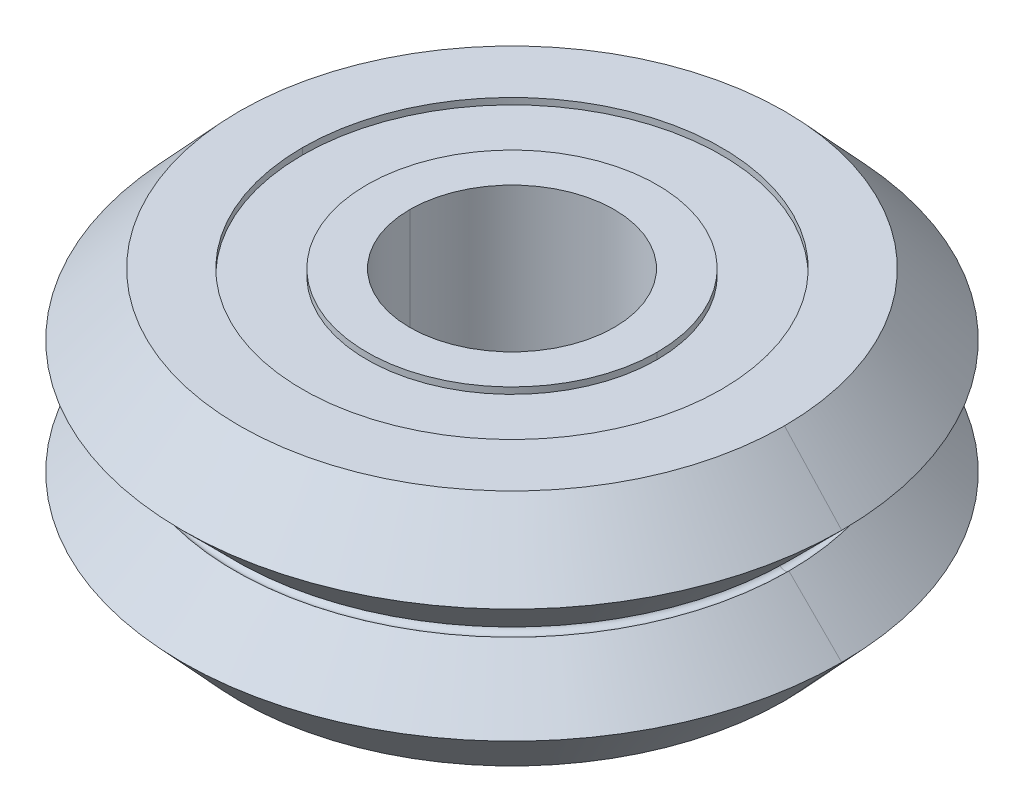
ISO-10303-21;
HEADER;
FILE_DESCRIPTION(('STEP AP214'),'2;1');
FILE_NAME('part.step','',(''),(''),'','','');
FILE_SCHEMA(('AUTOMOTIVE_DESIGN { 1 0 10303 214 1 1 1 1 }'));
ENDSEC;
DATA;
#1=APPLICATION_CONTEXT('core data for automotive mechanical design processes');
#2=APPLICATION_PROTOCOL_DEFINITION('international standard','automotive_design',2000,#1);
#3=PRODUCT_CONTEXT('',#1,'mechanical');
#4=PRODUCT('Part','Part','',(#3));
#5=PRODUCT_RELATED_PRODUCT_CATEGORY('part','',(#4));
#6=PRODUCT_DEFINITION_FORMATION('','',#4);
#7=PRODUCT_DEFINITION_CONTEXT('part definition',#1,'design');
#8=PRODUCT_DEFINITION('design','',#6,#7);
#9=PRODUCT_DEFINITION_SHAPE('','',#8);
#10=(LENGTH_UNIT() NAMED_UNIT(*) SI_UNIT(.MILLI.,.METRE.));
#11=(NAMED_UNIT(*) PLANE_ANGLE_UNIT() SI_UNIT($,.RADIAN.));
#12=(NAMED_UNIT(*) SI_UNIT($,.STERADIAN.) SOLID_ANGLE_UNIT());
#13=UNCERTAINTY_MEASURE_WITH_UNIT(LENGTH_MEASURE(1.E-05),#10,'distance_accuracy_value','');
#14=(GEOMETRIC_REPRESENTATION_CONTEXT(3) GLOBAL_UNCERTAINTY_ASSIGNED_CONTEXT((#13)) GLOBAL_UNIT_ASSIGNED_CONTEXT((#10,
#11,#12)) REPRESENTATION_CONTEXT('',''));
#15=CARTESIAN_POINT('',(0.,0.,0.));
#16=DIRECTION('',(0.,0.,1.));
#17=DIRECTION('',(1.,0.,0.));
#18=AXIS2_PLACEMENT_3D('',#15,#16,#17);
#19=CARTESIAN_POINT('',(0.,6.10500000000098,0.));
#20=DIRECTION('',(0.,-1.,0.));
#21=DIRECTION('',(-1.,0.,0.));
#22=AXIS2_PLACEMENT_3D('',#19,#20,#21);
#23=CYLINDRICAL_SURFACE('',#22,4.7625);
#24=CARTESIAN_POINT('',(0.,5.55000000000066,0.));
#25=DIRECTION('',(0.,1.,0.));
#26=DIRECTION('',(1.,0.,0.));
#27=AXIS2_PLACEMENT_3D('',#24,#25,#26);
#28=CIRCLE('',#27,4.7625);
#29=CARTESIAN_POINT('',(4.7625,5.55000000000066,0.));
#30=VERTEX_POINT('',#29);
#31=CARTESIAN_POINT('',(-4.7625,5.55000000000066,0.));
#32=VERTEX_POINT('',#31);
#33=EDGE_CURVE('E228',#30,#32,#28,.T.);
#34=ORIENTED_EDGE('',*,*,#33,.T.);
#35=DIRECTION('',(0.,-1.,0.));
#36=VECTOR('',#35,1.);
#37=CARTESIAN_POINT('',(-4.7625,5.55000000000066,0.));
#38=LINE('',#37,#36);
#39=CARTESIAN_POINT('',(-4.7625,-5.55000000000066,0.));
#40=VERTEX_POINT('',#39);
#41=EDGE_CURVE('E25',#32,#40,#38,.T.);
#42=ORIENTED_EDGE('',*,*,#41,.T.);
#43=CARTESIAN_POINT('',(0.,-5.55000000000066,0.));
#44=DIRECTION('',(0.,1.,0.));
#45=DIRECTION('',(1.,0.,0.));
#46=AXIS2_PLACEMENT_3D('',#43,#44,#45);
#47=CIRCLE('',#46,4.7625);
#48=CARTESIAN_POINT('',(4.7625,-5.55000000000066,0.));
#49=VERTEX_POINT('',#48);
#50=EDGE_CURVE('E601',#49,#40,#47,.T.);
#51=ORIENTED_EDGE('',*,*,#50,.F.);
#52=DIRECTION('',(0.,-1.,0.));
#53=VECTOR('',#52,1.);
#54=CARTESIAN_POINT('',(4.7625,5.55000000000066,0.));
#55=LINE('',#54,#53);
#56=EDGE_CURVE('E10',#30,#49,#55,.T.);
#57=ORIENTED_EDGE('',*,*,#56,.F.);
#58=EDGE_LOOP('',(#34,#42,#51,#57));
#59=FACE_BOUND('',#58,.T.);
#60=ADVANCED_FACE('F16',(#59),#23,.F.);
#61=CARTESIAN_POINT('',(0.,6.10500000000098,0.));
#62=DIRECTION('',(0.,-1.,0.));
#63=DIRECTION('',(-1.,0.,0.));
#64=AXIS2_PLACEMENT_3D('',#61,#62,#63);
#65=CYLINDRICAL_SURFACE('',#64,4.7625);
#66=CARTESIAN_POINT('',(0.,-5.55000000000066,0.));
#67=DIRECTION('',(0.,-1.,0.));
#68=DIRECTION('',(1.,0.,0.));
#69=AXIS2_PLACEMENT_3D('',#66,#67,#68);
#70=CIRCLE('',#69,4.7625);
#71=EDGE_CURVE('E585',#49,#40,#70,.T.);
#72=ORIENTED_EDGE('',*,*,#71,.T.);
#73=ORIENTED_EDGE('',*,*,#41,.F.);
#74=CARTESIAN_POINT('',(0.,5.55000000000066,0.));
#75=DIRECTION('',(0.,-1.,0.));
#76=DIRECTION('',(1.,0.,0.));
#77=AXIS2_PLACEMENT_3D('',#74,#75,#76);
#78=CIRCLE('',#77,4.7625);
#79=EDGE_CURVE('E19',#30,#32,#78,.T.);
#80=ORIENTED_EDGE('',*,*,#79,.F.);
#81=ORIENTED_EDGE('',*,*,#56,.T.);
#82=EDGE_LOOP('',(#72,#73,#80,#81));
#83=FACE_BOUND('',#82,.T.);
#84=ADVANCED_FACE('F290',(#83),#65,.F.);
#85=CARTESIAN_POINT('',(0.,5.55000000000066,0.));
#86=DIRECTION('',(0.,-1.,0.));
#87=DIRECTION('',(0.,0.,-1.));
#88=AXIS2_PLACEMENT_3D('',#85,#86,#87);
#89=PLANE('',#88);
#90=ORIENTED_EDGE('',*,*,#33,.F.);
#91=ORIENTED_EDGE('',*,*,#79,.T.);
#92=EDGE_LOOP('',(#90,#91));
#93=FACE_BOUND('',#92,.T.);
#94=CARTESIAN_POINT('',(0.,5.55000000000066,0.));
#95=DIRECTION('',(0.,-1.,0.));
#96=DIRECTION('',(1.,0.,0.));
#97=AXIS2_PLACEMENT_3D('',#94,#95,#96);
#98=CIRCLE('',#97,6.76249999999962);
#99=CARTESIAN_POINT('',(6.76249999999962,5.55000000000066,0.));
#100=VERTEX_POINT('',#99);
#101=CARTESIAN_POINT('',(-6.76249999999962,5.55000000000066,0.));
#102=VERTEX_POINT('',#101);
#103=EDGE_CURVE('E214',#100,#102,#98,.T.);
#104=ORIENTED_EDGE('',*,*,#103,.F.);
#105=CARTESIAN_POINT('',(0.,5.55000000000066,0.));
#106=DIRECTION('',(0.,1.,0.));
#107=DIRECTION('',(1.,0.,0.));
#108=AXIS2_PLACEMENT_3D('',#105,#106,#107);
#109=CIRCLE('',#108,6.76249999999962);
#110=EDGE_CURVE('E226',#100,#102,#109,.T.);
#111=ORIENTED_EDGE('',*,*,#110,.T.);
#112=EDGE_LOOP('',(#104,#111));
#113=FACE_BOUND('',#112,.T.);
#114=ADVANCED_FACE('F294',(#93,#113),#89,.F.);
#115=CARTESIAN_POINT('',(0.,6.10500000000098,0.));
#116=DIRECTION('',(0.,-1.,0.));
#117=DIRECTION('',(-1.,0.,0.));
#118=AXIS2_PLACEMENT_3D('',#115,#116,#117);
#119=CYLINDRICAL_SURFACE('',#118,6.76249999999962);
#120=CARTESIAN_POINT('',(0.,5.24999999999932,0.));
#121=DIRECTION('',(0.,1.,0.));
#122=DIRECTION('',(1.,0.,0.));
#123=AXIS2_PLACEMENT_3D('',#120,#121,#122);
#124=CIRCLE('',#123,6.76249999999962);
#125=CARTESIAN_POINT('',(6.76249999999962,5.24999999999932,0.));
#126=VERTEX_POINT('',#125);
#127=CARTESIAN_POINT('',(-6.76249999999962,5.24999999999932,0.));
#128=VERTEX_POINT('',#127);
#129=EDGE_CURVE('E206',#126,#128,#124,.T.);
#130=ORIENTED_EDGE('',*,*,#129,.T.);
#131=DIRECTION('',(0.,1.,0.));
#132=VECTOR('',#131,1.);
#133=CARTESIAN_POINT('',(-6.76249999999962,5.24999999999932,0.));
#134=LINE('',#133,#132);
#135=EDGE_CURVE('E218',#128,#102,#134,.T.);
#136=ORIENTED_EDGE('',*,*,#135,.T.);
#137=ORIENTED_EDGE('',*,*,#110,.F.);
#138=DIRECTION('',(0.,1.,0.));
#139=VECTOR('',#138,1.);
#140=CARTESIAN_POINT('',(6.76249999999962,5.24999999999932,0.));
#141=LINE('',#140,#139);
#142=EDGE_CURVE('E222',#126,#100,#141,.T.);
#143=ORIENTED_EDGE('',*,*,#142,.F.);
#144=EDGE_LOOP('',(#130,#136,#137,#143));
#145=FACE_BOUND('',#144,.T.);
#146=ADVANCED_FACE('F298',(#145),#119,.T.);
#147=CARTESIAN_POINT('',(0.,6.10500000000098,0.));
#148=DIRECTION('',(0.,-1.,0.));
#149=DIRECTION('',(-1.,0.,0.));
#150=AXIS2_PLACEMENT_3D('',#147,#148,#149);
#151=CYLINDRICAL_SURFACE('',#150,6.76249999999962);
#152=ORIENTED_EDGE('',*,*,#103,.T.);
#153=ORIENTED_EDGE('',*,*,#135,.F.);
#154=CARTESIAN_POINT('',(0.,5.24999999999932,0.));
#155=DIRECTION('',(0.,-1.,0.));
#156=DIRECTION('',(1.,0.,0.));
#157=AXIS2_PLACEMENT_3D('',#154,#155,#156);
#158=CIRCLE('',#157,6.76249999999962);
#159=EDGE_CURVE('E210',#126,#128,#158,.T.);
#160=ORIENTED_EDGE('',*,*,#159,.F.);
#161=ORIENTED_EDGE('',*,*,#142,.T.);
#162=EDGE_LOOP('',(#152,#153,#160,#161));
#163=FACE_BOUND('',#162,.T.);
#164=ADVANCED_FACE('F303',(#163),#151,.T.);
#165=CARTESIAN_POINT('',(0.,5.24999999999932,0.));
#166=DIRECTION('',(0.,-1.,0.));
#167=DIRECTION('',(0.,0.,-1.));
#168=AXIS2_PLACEMENT_3D('',#165,#166,#167);
#169=PLANE('',#168);
#170=ORIENTED_EDGE('',*,*,#129,.F.);
#171=ORIENTED_EDGE('',*,*,#159,.T.);
#172=EDGE_LOOP('',(#170,#171));
#173=FACE_BOUND('',#172,.T.);
#174=CARTESIAN_POINT('',(0.,5.24999999999932,0.));
#175=DIRECTION('',(0.,-1.,0.));
#176=DIRECTION('',(1.,0.,0.));
#177=AXIS2_PLACEMENT_3D('',#174,#175,#176);
#178=CIRCLE('',#177,9.76250000000032);
#179=CARTESIAN_POINT('',(9.76250000000032,5.24999999999932,0.));
#180=VERTEX_POINT('',#179);
#181=CARTESIAN_POINT('',(-9.76250000000032,5.24999999999932,0.));
#182=VERTEX_POINT('',#181);
#183=EDGE_CURVE('E185',#180,#182,#178,.T.);
#184=ORIENTED_EDGE('',*,*,#183,.F.);
#185=CARTESIAN_POINT('',(0.,5.24999999999932,0.));
#186=DIRECTION('',(0.,1.,0.));
#187=DIRECTION('',(1.,0.,0.));
#188=AXIS2_PLACEMENT_3D('',#185,#186,#187);
#189=CIRCLE('',#188,9.76250000000032);
#190=EDGE_CURVE('E173',#180,#182,#189,.T.);
#191=ORIENTED_EDGE('',*,*,#190,.T.);
#192=EDGE_LOOP('',(#184,#191));
#193=FACE_BOUND('',#192,.T.);
#194=ADVANCED_FACE('F307',(#173,#193),#169,.F.);
#195=CARTESIAN_POINT('',(0.,6.10500000000098,0.));
#196=DIRECTION('',(0.,-1.,0.));
#197=DIRECTION('',(-1.,0.,0.));
#198=AXIS2_PLACEMENT_3D('',#195,#196,#197);
#199=CYLINDRICAL_SURFACE('',#198,9.76250000000032);
#200=CARTESIAN_POINT('',(0.,5.55000000000066,0.));
#201=DIRECTION('',(0.,1.,0.));
#202=DIRECTION('',(1.,0.,0.));
#203=AXIS2_PLACEMENT_3D('',#200,#201,#202);
#204=CIRCLE('',#203,9.76250000000032);
#205=CARTESIAN_POINT('',(9.76250000000032,5.55000000000066,0.));
#206=VERTEX_POINT('',#205);
#207=CARTESIAN_POINT('',(-9.76250000000032,5.55000000000066,0.));
#208=VERTEX_POINT('',#207);
#209=EDGE_CURVE('E172',#206,#208,#204,.T.);
#210=ORIENTED_EDGE('',*,*,#209,.T.);
#211=DIRECTION('',(0.,-1.,0.));
#212=VECTOR('',#211,1.);
#213=CARTESIAN_POINT('',(-9.76250000000032,5.55000000000066,0.));
#214=LINE('',#213,#212);
#215=EDGE_CURVE('E178',#208,#182,#214,.T.);
#216=ORIENTED_EDGE('',*,*,#215,.T.);
#217=ORIENTED_EDGE('',*,*,#190,.F.);
#218=DIRECTION('',(0.,-1.,0.));
#219=VECTOR('',#218,1.);
#220=CARTESIAN_POINT('',(9.76250000000032,5.55000000000066,0.));
#221=LINE('',#220,#219);
#222=EDGE_CURVE('E167',#206,#180,#221,.T.);
#223=ORIENTED_EDGE('',*,*,#222,.F.);
#224=EDGE_LOOP('',(#210,#216,#217,#223));
#225=FACE_BOUND('',#224,.T.);
#226=ADVANCED_FACE('F169',(#225),#199,.F.);
#227=CARTESIAN_POINT('',(0.,6.10500000000098,0.));
#228=DIRECTION('',(0.,-1.,0.));
#229=DIRECTION('',(-1.,0.,0.));
#230=AXIS2_PLACEMENT_3D('',#227,#228,#229);
#231=CYLINDRICAL_SURFACE('',#230,9.76250000000032);
#232=ORIENTED_EDGE('',*,*,#183,.T.);
#233=ORIENTED_EDGE('',*,*,#215,.F.);
#234=CARTESIAN_POINT('',(0.,5.55000000000066,0.));
#235=DIRECTION('',(0.,-1.,0.));
#236=DIRECTION('',(1.,0.,0.));
#237=AXIS2_PLACEMENT_3D('',#234,#235,#236);
#238=CIRCLE('',#237,9.76250000000032);
#239=EDGE_CURVE('E181',#206,#208,#238,.T.);
#240=ORIENTED_EDGE('',*,*,#239,.F.);
#241=ORIENTED_EDGE('',*,*,#222,.T.);
#242=EDGE_LOOP('',(#232,#233,#240,#241));
#243=FACE_BOUND('',#242,.T.);
#244=ADVANCED_FACE('F182',(#243),#231,.F.);
#245=CARTESIAN_POINT('',(0.,5.55000000000066,0.));
#246=DIRECTION('',(0.,-1.,0.));
#247=DIRECTION('',(0.,0.,-1.));
#248=AXIS2_PLACEMENT_3D('',#245,#246,#247);
#249=PLANE('',#248);
#250=ORIENTED_EDGE('',*,*,#209,.F.);
#251=ORIENTED_EDGE('',*,*,#239,.T.);
#252=EDGE_LOOP('',(#250,#251));
#253=FACE_BOUND('',#252,.T.);
#254=CARTESIAN_POINT('',(0.,5.55000000000066,0.));
#255=DIRECTION('',(0.,-1.,0.));
#256=DIRECTION('',(1.,0.,0.));
#257=AXIS2_PLACEMENT_3D('',#254,#255,#256);
#258=CIRCLE('',#257,12.7);
#259=CARTESIAN_POINT('',(12.7,5.55000000000066,0.));
#260=VERTEX_POINT('',#259);
#261=CARTESIAN_POINT('',(-12.7,5.55000000000066,0.));
#262=VERTEX_POINT('',#261);
#263=EDGE_CURVE('E260',#260,#262,#258,.T.);
#264=ORIENTED_EDGE('',*,*,#263,.F.);
#265=CARTESIAN_POINT('',(0.,5.55000000000066,0.));
#266=DIRECTION('',(0.,1.,0.));
#267=DIRECTION('',(1.,0.,0.));
#268=AXIS2_PLACEMENT_3D('',#265,#266,#267);
#269=CIRCLE('',#268,12.7);
#270=EDGE_CURVE('E190',#260,#262,#269,.T.);
#271=ORIENTED_EDGE('',*,*,#270,.T.);
#272=EDGE_LOOP('',(#264,#271));
#273=FACE_BOUND('',#272,.T.);
#274=ADVANCED_FACE('F187',(#253,#273),#249,.F.);
#275=CARTESIAN_POINT('',(0.,4.10750000000008,0.));
#276=DIRECTION('',(0.,-1.,0.));
#277=DIRECTION('',(-1.,0.,0.));
#278=AXIS2_PLACEMENT_3D('',#275,#276,#277);
#279=CONICAL_SURFACE('',#278,14.032500000001,0.745779266141154);
#280=CARTESIAN_POINT('',(0.,2.6649999999995,0.));
#281=DIRECTION('',(0.,1.,0.));
#282=DIRECTION('',(1.,0.,0.));
#283=AXIS2_PLACEMENT_3D('',#280,#281,#282);
#284=CIRCLE('',#283,15.3649999999995);
#285=CARTESIAN_POINT('',(15.3649999999995,2.6649999999995,0.));
#286=VERTEX_POINT('',#285);
#287=CARTESIAN_POINT('',(-15.3649999999995,2.6649999999995,0.));
#288=VERTEX_POINT('',#287);
#289=EDGE_CURVE('E251',#286,#288,#284,.T.);
#290=ORIENTED_EDGE('',*,*,#289,.T.);
#291=DIRECTION('',(0.678544433659872,0.73455935876497,0.));
#292=VECTOR('',#291,1.);
#293=CARTESIAN_POINT('',(-15.3649999999995,2.6649999999995,0.));
#294=LINE('',#293,#292);
#295=EDGE_CURVE('E263',#288,#262,#294,.T.);
#296=ORIENTED_EDGE('',*,*,#295,.T.);
#297=ORIENTED_EDGE('',*,*,#270,.F.);
#298=DIRECTION('',(-0.678544433659872,0.73455935876497,0.));
#299=VECTOR('',#298,1.);
#300=CARTESIAN_POINT('',(15.3649999999995,2.6649999999995,0.));
#301=LINE('',#300,#299);
#302=EDGE_CURVE('E195',#286,#260,#301,.T.);
#303=ORIENTED_EDGE('',*,*,#302,.F.);
#304=EDGE_LOOP('',(#290,#296,#297,#303));
#305=FACE_BOUND('',#304,.T.);
#306=ADVANCED_FACE('F275',(#305),#279,.T.);
#307=CARTESIAN_POINT('',(0.,4.10750000000008,0.));
#308=DIRECTION('',(0.,-1.,0.));
#309=DIRECTION('',(-1.,0.,0.));
#310=AXIS2_PLACEMENT_3D('',#307,#308,#309);
#311=CONICAL_SURFACE('',#310,14.032500000001,0.745779266141154);
#312=ORIENTED_EDGE('',*,*,#263,.T.);
#313=ORIENTED_EDGE('',*,*,#295,.F.);
#314=CARTESIAN_POINT('',(0.,2.6649999999995,0.));
#315=DIRECTION('',(0.,-1.,0.));
#316=DIRECTION('',(1.,0.,0.));
#317=AXIS2_PLACEMENT_3D('',#314,#315,#316);
#318=CIRCLE('',#317,15.3649999999995);
#319=EDGE_CURVE('E259',#286,#288,#318,.T.);
#320=ORIENTED_EDGE('',*,*,#319,.F.);
#321=ORIENTED_EDGE('',*,*,#302,.T.);
#322=EDGE_LOOP('',(#312,#313,#320,#321));
#323=FACE_BOUND('',#322,.T.);
#324=ADVANCED_FACE('F273',(#323),#311,.T.);
#325=CARTESIAN_POINT('',(0.,1.43577294539223,0.));
#326=DIRECTION('',(0.,1.,0.));
#327=DIRECTION('',(1.,0.,0.));
#328=AXIS2_PLACEMENT_3D('',#325,#326,#327);
#329=CONICAL_SURFACE('',#328,14.1357729453927,0.7853981633973);
#330=ORIENTED_EDGE('',*,*,#319,.T.);
#331=DIRECTION('',(-0.707106781186498,0.707106781186598,0.));
#332=VECTOR('',#331,1.);
#333=CARTESIAN_POINT('',(-12.9065458907834,0.206545890784609,0.));
#334=LINE('',#333,#332);
#335=CARTESIAN_POINT('',(-12.9065458907834,0.206545890784609,0.));
#336=VERTEX_POINT('',#335);
#337=EDGE_CURVE('E250',#336,#288,#334,.T.);
#338=ORIENTED_EDGE('',*,*,#337,.F.);
#339=CARTESIAN_POINT('',(0.,0.206545890784583,0.));
#340=DIRECTION('',(0.,-1.,0.));
#341=DIRECTION('',(1.,0.,0.));
#342=AXIS2_PLACEMENT_3D('',#339,#340,#341);
#343=CIRCLE('',#342,12.9065458907834);
#344=CARTESIAN_POINT('',(12.9065458907834,0.206545890784609,0.));
#345=VERTEX_POINT('',#344);
#346=EDGE_CURVE('E685',#345,#336,#343,.T.);
#347=ORIENTED_EDGE('',*,*,#346,.F.);
#348=DIRECTION('',(0.707106781186498,0.707106781186598,0.));
#349=VECTOR('',#348,1.);
#350=CARTESIAN_POINT('',(12.9065458907834,0.206545890784609,0.));
#351=LINE('',#350,#349);
#352=EDGE_CURVE('E255',#345,#286,#351,.T.);
#353=ORIENTED_EDGE('',*,*,#352,.T.);
#354=EDGE_LOOP('',(#330,#338,#347,#353));
#355=FACE_BOUND('',#354,.T.);
#356=ADVANCED_FACE('F285',(#355),#329,.T.);
#357=CARTESIAN_POINT('',(0.,1.43577294539223,0.));
#358=DIRECTION('',(0.,1.,0.));
#359=DIRECTION('',(1.,0.,0.));
#360=AXIS2_PLACEMENT_3D('',#357,#358,#359);
#361=CONICAL_SURFACE('',#360,14.1357729453927,0.7853981633973);
#362=CARTESIAN_POINT('',(0.,0.206545890784583,0.));
#363=DIRECTION('',(0.,1.,0.));
#364=DIRECTION('',(1.,0.,0.));
#365=AXIS2_PLACEMENT_3D('',#362,#363,#364);
#366=CIRCLE('',#365,12.9065458907834);
#367=EDGE_CURVE('E246',#345,#336,#366,.T.);
#368=ORIENTED_EDGE('',*,*,#367,.T.);
#369=ORIENTED_EDGE('',*,*,#337,.T.);
#370=ORIENTED_EDGE('',*,*,#289,.F.);
#371=ORIENTED_EDGE('',*,*,#352,.F.);
#372=EDGE_LOOP('',(#368,#369,#370,#371));
#373=FACE_BOUND('',#372,.T.);
#374=ADVANCED_FACE('F351',(#373),#361,.T.);
#375=CARTESIAN_POINT('',(0.,0.,0.));
#376=DIRECTION('',(0.,-1.,0.));
#377=DIRECTION('',(-1.,0.,0.));
#378=AXIS2_PLACEMENT_3D('',#375,#376,#377);
#379=TOROIDAL_SURFACE('',#378,12.7,0.2921);
#380=CARTESIAN_POINT('',(0.,-0.206545890784583,0.));
#381=DIRECTION('',(0.,1.,0.));
#382=DIRECTION('',(1.,0.,0.));
#383=AXIS2_PLACEMENT_3D('',#380,#381,#382);
#384=CIRCLE('',#383,12.9065458907834);
#385=CARTESIAN_POINT('',(12.9065458907834,-0.206545890784609,0.));
#386=VERTEX_POINT('',#385);
#387=CARTESIAN_POINT('',(-12.9065458907834,-0.206545890784583,0.));
#388=VERTEX_POINT('',#387);
#389=EDGE_CURVE('E654',#386,#388,#384,.T.);
#390=ORIENTED_EDGE('',*,*,#389,.T.);
#391=CARTESIAN_POINT('',(-12.7,0.,0.));
#392=DIRECTION('',(0.,0.,1.));
#393=DIRECTION('',(-0.707106781186498,-0.707106781186597,0.));
#394=AXIS2_PLACEMENT_3D('',#391,#392,#393);
#395=CIRCLE('',#394,0.2921);
#396=EDGE_CURVE('E688',#388,#336,#395,.T.);
#397=ORIENTED_EDGE('',*,*,#396,.T.);
#398=ORIENTED_EDGE('',*,*,#367,.F.);
#399=CARTESIAN_POINT('',(12.7,0.,0.));
#400=DIRECTION('',(0.,0.,-1.));
#401=DIRECTION('',(0.707106781186498,-0.707106781186597,0.));
#402=AXIS2_PLACEMENT_3D('',#399,#400,#401);
#403=CIRCLE('',#402,0.2921);
#404=EDGE_CURVE('E244',#386,#345,#403,.T.);
#405=ORIENTED_EDGE('',*,*,#404,.F.);
#406=EDGE_LOOP('',(#390,#397,#398,#405));
#407=FACE_BOUND('',#406,.T.);
#408=ADVANCED_FACE('F363',(#407),#379,.F.);
#409=CARTESIAN_POINT('',(0.,0.,0.));
#410=DIRECTION('',(0.,-1.,0.));
#411=DIRECTION('',(-1.,0.,0.));
#412=AXIS2_PLACEMENT_3D('',#409,#410,#411);
#413=TOROIDAL_SURFACE('',#412,12.7,0.2921);
#414=ORIENTED_EDGE('',*,*,#346,.T.);
#415=ORIENTED_EDGE('',*,*,#396,.F.);
#416=CARTESIAN_POINT('',(0.,-0.206545890784583,0.));
#417=DIRECTION('',(0.,-1.,0.));
#418=DIRECTION('',(1.,0.,0.));
#419=AXIS2_PLACEMENT_3D('',#416,#417,#418);
#420=CIRCLE('',#419,12.9065458907834);
#421=EDGE_CURVE('E681',#386,#388,#420,.T.);
#422=ORIENTED_EDGE('',*,*,#421,.F.);
#423=ORIENTED_EDGE('',*,*,#404,.T.);
#424=EDGE_LOOP('',(#414,#415,#422,#423));
#425=FACE_BOUND('',#424,.T.);
#426=ADVANCED_FACE('F372',(#425),#413,.F.);
#427=CARTESIAN_POINT('',(0.,-1.43577294539223,0.));
#428=DIRECTION('',(0.,-1.,0.));
#429=DIRECTION('',(-1.,0.,0.));
#430=AXIS2_PLACEMENT_3D('',#427,#428,#429);
#431=CONICAL_SURFACE('',#430,14.1357729453927,0.7853981633973);
#432=ORIENTED_EDGE('',*,*,#421,.T.);
#433=DIRECTION('',(0.707106781186498,0.707106781186598,0.));
#434=VECTOR('',#433,1.);
#435=CARTESIAN_POINT('',(-15.3649999999995,-2.6649999999995,0.));
#436=LINE('',#435,#434);
#437=CARTESIAN_POINT('',(-15.3649999999995,-2.6649999999995,0.));
#438=VERTEX_POINT('',#437);
#439=EDGE_CURVE('E650',#438,#388,#436,.T.);
#440=ORIENTED_EDGE('',*,*,#439,.F.);
#441=CARTESIAN_POINT('',(0.,-2.6649999999995,0.));
#442=DIRECTION('',(0.,-1.,0.));
#443=DIRECTION('',(1.,0.,0.));
#444=AXIS2_PLACEMENT_3D('',#441,#442,#443);
#445=CIRCLE('',#444,15.3649999999995);
#446=CARTESIAN_POINT('',(15.3649999999995,-2.6649999999995,0.));
#447=VERTEX_POINT('',#446);
#448=EDGE_CURVE('E608',#447,#438,#445,.T.);
#449=ORIENTED_EDGE('',*,*,#448,.F.);
#450=DIRECTION('',(-0.707106781186498,0.707106781186598,0.));
#451=VECTOR('',#450,1.);
#452=CARTESIAN_POINT('',(15.3649999999995,-2.6649999999995,0.));
#453=LINE('',#452,#451);
#454=EDGE_CURVE('E677',#447,#386,#453,.T.);
#455=ORIENTED_EDGE('',*,*,#454,.T.);
#456=EDGE_LOOP('',(#432,#440,#449,#455));
#457=FACE_BOUND('',#456,.T.);
#458=ADVANCED_FACE('F383',(#457),#431,.T.);
#459=CARTESIAN_POINT('',(0.,-1.43577294539223,0.));
#460=DIRECTION('',(0.,-1.,0.));
#461=DIRECTION('',(-1.,0.,0.));
#462=AXIS2_PLACEMENT_3D('',#459,#460,#461);
#463=CONICAL_SURFACE('',#462,14.1357729453927,0.7853981633973);
#464=CARTESIAN_POINT('',(0.,-2.6649999999995,0.));
#465=DIRECTION('',(0.,1.,0.));
#466=DIRECTION('',(1.,0.,0.));
#467=AXIS2_PLACEMENT_3D('',#464,#465,#466);
#468=CIRCLE('',#467,15.3649999999995);
#469=EDGE_CURVE('E655',#447,#438,#468,.T.);
#470=ORIENTED_EDGE('',*,*,#469,.T.);
#471=ORIENTED_EDGE('',*,*,#439,.T.);
#472=ORIENTED_EDGE('',*,*,#389,.F.);
#473=ORIENTED_EDGE('',*,*,#454,.F.);
#474=EDGE_LOOP('',(#470,#471,#472,#473));
#475=FACE_BOUND('',#474,.T.);
#476=ADVANCED_FACE('F394',(#475),#463,.T.);
#477=CARTESIAN_POINT('',(0.,-4.10750000000008,0.));
#478=DIRECTION('',(0.,1.,0.));
#479=DIRECTION('',(1.,0.,0.));
#480=AXIS2_PLACEMENT_3D('',#477,#478,#479);
#481=CONICAL_SURFACE('',#480,14.032500000001,0.745779266141154);
#482=CARTESIAN_POINT('',(0.,-5.55000000000066,0.));
#483=DIRECTION('',(0.,1.,0.));
#484=DIRECTION('',(1.,0.,0.));
#485=AXIS2_PLACEMENT_3D('',#482,#483,#484);
#486=CIRCLE('',#485,12.7);
#487=CARTESIAN_POINT('',(12.7,-5.55000000000066,0.));
#488=VERTEX_POINT('',#487);
#489=CARTESIAN_POINT('',(-12.7,-5.55000000000066,0.));
#490=VERTEX_POINT('',#489);
#491=EDGE_CURVE('E609',#488,#490,#486,.T.);
#492=ORIENTED_EDGE('',*,*,#491,.T.);
#493=DIRECTION('',(-0.678544433659872,0.73455935876497,0.));
#494=VECTOR('',#493,1.);
#495=CARTESIAN_POINT('',(-12.7,-5.55000000000066,0.));
#496=LINE('',#495,#494);
#497=EDGE_CURVE('E661',#490,#438,#496,.T.);
#498=ORIENTED_EDGE('',*,*,#497,.T.);
#499=ORIENTED_EDGE('',*,*,#469,.F.);
#500=DIRECTION('',(0.678544433659872,0.73455935876497,0.));
#501=VECTOR('',#500,1.);
#502=CARTESIAN_POINT('',(12.7,-5.55000000000066,0.));
#503=LINE('',#502,#501);
#504=EDGE_CURVE('E667',#488,#447,#503,.T.);
#505=ORIENTED_EDGE('',*,*,#504,.F.);
#506=EDGE_LOOP('',(#492,#498,#499,#505));
#507=FACE_BOUND('',#506,.T.);
#508=ADVANCED_FACE('F405',(#507),#481,.T.);
#509=CARTESIAN_POINT('',(0.,-4.10750000000008,0.));
#510=DIRECTION('',(0.,1.,0.));
#511=DIRECTION('',(1.,0.,0.));
#512=AXIS2_PLACEMENT_3D('',#509,#510,#511);
#513=CONICAL_SURFACE('',#512,14.032500000001,0.745779266141154);
#514=ORIENTED_EDGE('',*,*,#448,.T.);
#515=ORIENTED_EDGE('',*,*,#497,.F.);
#516=CARTESIAN_POINT('',(0.,-5.55000000000066,0.));
#517=DIRECTION('',(0.,-1.,0.));
#518=DIRECTION('',(1.,0.,0.));
#519=AXIS2_PLACEMENT_3D('',#516,#517,#518);
#520=CIRCLE('',#519,12.7);
#521=EDGE_CURVE('E604',#488,#490,#520,.T.);
#522=ORIENTED_EDGE('',*,*,#521,.F.);
#523=ORIENTED_EDGE('',*,*,#504,.T.);
#524=EDGE_LOOP('',(#514,#515,#522,#523));
#525=FACE_BOUND('',#524,.T.);
#526=ADVANCED_FACE('F416',(#525),#513,.T.);
#527=CARTESIAN_POINT('',(0.,-5.55000000000066,0.));
#528=DIRECTION('',(0.,-1.,0.));
#529=DIRECTION('',(0.,0.,-1.));
#530=AXIS2_PLACEMENT_3D('',#527,#528,#529);
#531=PLANE('',#530);
#532=CARTESIAN_POINT('',(0.,-5.55000000000066,0.));
#533=DIRECTION('',(0.,-1.,0.));
#534=DIRECTION('',(1.,0.,0.));
#535=AXIS2_PLACEMENT_3D('',#532,#533,#534);
#536=CIRCLE('',#535,9.76250000000032);
#537=CARTESIAN_POINT('',(9.76250000000032,-5.55000000000066,0.));
#538=VERTEX_POINT('',#537);
#539=CARTESIAN_POINT('',(-9.76250000000032,-5.55000000000066,0.));
#540=VERTEX_POINT('',#539);
#541=EDGE_CURVE('E637',#538,#540,#536,.T.);
#542=ORIENTED_EDGE('',*,*,#541,.F.);
#543=CARTESIAN_POINT('',(0.,-5.55000000000066,0.));
#544=DIRECTION('',(0.,1.,0.));
#545=DIRECTION('',(1.,0.,0.));
#546=AXIS2_PLACEMENT_3D('',#543,#544,#545);
#547=CIRCLE('',#546,9.76250000000032);
#548=EDGE_CURVE('E627',#538,#540,#547,.T.);
#549=ORIENTED_EDGE('',*,*,#548,.T.);
#550=EDGE_LOOP('',(#542,#549));
#551=FACE_BOUND('',#550,.T.);
#552=ORIENTED_EDGE('',*,*,#491,.F.);
#553=ORIENTED_EDGE('',*,*,#521,.T.);
#554=EDGE_LOOP('',(#552,#553));
#555=FACE_BOUND('',#554,.T.);
#556=ADVANCED_FACE('F427',(#551,#555),#531,.T.);
#557=CARTESIAN_POINT('',(0.,6.10500000000098,0.));
#558=DIRECTION('',(0.,-1.,0.));
#559=DIRECTION('',(-1.,0.,0.));
#560=AXIS2_PLACEMENT_3D('',#557,#558,#559);
#561=CYLINDRICAL_SURFACE('',#560,9.76250000000032);
#562=CARTESIAN_POINT('',(0.,-5.24999999999932,0.));
#563=DIRECTION('',(0.,1.,0.));
#564=DIRECTION('',(1.,0.,0.));
#565=AXIS2_PLACEMENT_3D('',#562,#563,#564);
#566=CIRCLE('',#565,9.76250000000032);
#567=CARTESIAN_POINT('',(9.76250000000032,-5.24999999999932,0.));
#568=VERTEX_POINT('',#567);
#569=CARTESIAN_POINT('',(-9.76250000000032,-5.24999999999932,0.));
#570=VERTEX_POINT('',#569);
#571=EDGE_CURVE('E638',#568,#570,#566,.T.);
#572=ORIENTED_EDGE('',*,*,#571,.T.);
#573=DIRECTION('',(0.,-1.,0.));
#574=VECTOR('',#573,1.);
#575=CARTESIAN_POINT('',(-9.76250000000032,-5.24999999999932,0.));
#576=LINE('',#575,#574);
#577=EDGE_CURVE('E632',#570,#540,#576,.T.);
#578=ORIENTED_EDGE('',*,*,#577,.T.);
#579=ORIENTED_EDGE('',*,*,#548,.F.);
#580=DIRECTION('',(0.,-1.,0.));
#581=VECTOR('',#580,1.);
#582=CARTESIAN_POINT('',(9.76250000000032,-5.24999999999932,0.));
#583=LINE('',#582,#581);
#584=EDGE_CURVE('E628',#568,#538,#583,.T.);
#585=ORIENTED_EDGE('',*,*,#584,.F.);
#586=EDGE_LOOP('',(#572,#578,#579,#585));
#587=FACE_BOUND('',#586,.T.);
#588=ADVANCED_FACE('F438',(#587),#561,.F.);
#589=CARTESIAN_POINT('',(0.,6.10500000000098,0.));
#590=DIRECTION('',(0.,-1.,0.));
#591=DIRECTION('',(-1.,0.,0.));
#592=AXIS2_PLACEMENT_3D('',#589,#590,#591);
#593=CYLINDRICAL_SURFACE('',#592,9.76250000000032);
#594=ORIENTED_EDGE('',*,*,#541,.T.);
#595=ORIENTED_EDGE('',*,*,#577,.F.);
#596=CARTESIAN_POINT('',(0.,-5.24999999999932,0.));
#597=DIRECTION('',(0.,-1.,0.));
#598=DIRECTION('',(1.,0.,0.));
#599=AXIS2_PLACEMENT_3D('',#596,#597,#598);
#600=CIRCLE('',#599,9.76250000000032);
#601=EDGE_CURVE('E633',#568,#570,#600,.T.);
#602=ORIENTED_EDGE('',*,*,#601,.F.);
#603=ORIENTED_EDGE('',*,*,#584,.T.);
#604=EDGE_LOOP('',(#594,#595,#602,#603));
#605=FACE_BOUND('',#604,.T.);
#606=ADVANCED_FACE('F449',(#605),#593,.F.);
#607=CARTESIAN_POINT('',(0.,-5.24999999999932,0.));
#608=DIRECTION('',(0.,-1.,0.));
#609=DIRECTION('',(0.,0.,-1.));
#610=AXIS2_PLACEMENT_3D('',#607,#608,#609);
#611=PLANE('',#610);
#612=CARTESIAN_POINT('',(0.,-5.24999999999932,0.));
#613=DIRECTION('',(0.,-1.,0.));
#614=DIRECTION('',(1.,0.,0.));
#615=AXIS2_PLACEMENT_3D('',#612,#613,#614);
#616=CIRCLE('',#615,6.76249999999962);
#617=CARTESIAN_POINT('',(6.76249999999962,-5.24999999999932,0.));
#618=VERTEX_POINT('',#617);
#619=CARTESIAN_POINT('',(-6.76249999999962,-5.24999999999932,0.));
#620=VERTEX_POINT('',#619);
#621=EDGE_CURVE('E612',#618,#620,#616,.T.);
#622=ORIENTED_EDGE('',*,*,#621,.F.);
#623=CARTESIAN_POINT('',(0.,-5.24999999999932,0.));
#624=DIRECTION('',(0.,1.,0.));
#625=DIRECTION('',(1.,0.,0.));
#626=AXIS2_PLACEMENT_3D('',#623,#624,#625);
#627=CIRCLE('',#626,6.76249999999962);
#628=EDGE_CURVE('E623',#618,#620,#627,.T.);
#629=ORIENTED_EDGE('',*,*,#628,.T.);
#630=EDGE_LOOP('',(#622,#629));
#631=FACE_BOUND('',#630,.T.);
#632=ORIENTED_EDGE('',*,*,#571,.F.);
#633=ORIENTED_EDGE('',*,*,#601,.T.);
#634=EDGE_LOOP('',(#632,#633));
#635=FACE_BOUND('',#634,.T.);
#636=ADVANCED_FACE('F460',(#631,#635),#611,.T.);
#637=CARTESIAN_POINT('',(0.,6.10500000000098,0.));
#638=DIRECTION('',(0.,-1.,0.));
#639=DIRECTION('',(-1.,0.,0.));
#640=AXIS2_PLACEMENT_3D('',#637,#638,#639);
#641=CYLINDRICAL_SURFACE('',#640,6.76249999999962);
#642=CARTESIAN_POINT('',(0.,-5.55000000000066,0.));
#643=DIRECTION('',(0.,1.,0.));
#644=DIRECTION('',(1.,0.,0.));
#645=AXIS2_PLACEMENT_3D('',#642,#643,#644);
#646=CIRCLE('',#645,6.76249999999962);
#647=CARTESIAN_POINT('',(6.76249999999962,-5.55000000000066,0.));
#648=VERTEX_POINT('',#647);
#649=CARTESIAN_POINT('',(-6.76249999999962,-5.55000000000066,0.));
#650=VERTEX_POINT('',#649);
#651=EDGE_CURVE('E589',#648,#650,#646,.T.);
#652=ORIENTED_EDGE('',*,*,#651,.T.);
#653=DIRECTION('',(0.,1.,0.));
#654=VECTOR('',#653,1.);
#655=CARTESIAN_POINT('',(-6.76249999999962,-5.55000000000066,0.));
#656=LINE('',#655,#654);
#657=EDGE_CURVE('E616',#650,#620,#656,.T.);
#658=ORIENTED_EDGE('',*,*,#657,.T.);
#659=ORIENTED_EDGE('',*,*,#628,.F.);
#660=DIRECTION('',(0.,1.,0.));
#661=VECTOR('',#660,1.);
#662=CARTESIAN_POINT('',(6.76249999999962,-5.55000000000066,0.));
#663=LINE('',#662,#661);
#664=EDGE_CURVE('E619',#648,#618,#663,.T.);
#665=ORIENTED_EDGE('',*,*,#664,.F.);
#666=EDGE_LOOP('',(#652,#658,#659,#665));
#667=FACE_BOUND('',#666,.T.);
#668=ADVANCED_FACE('F471',(#667),#641,.T.);
#669=CARTESIAN_POINT('',(0.,6.10500000000098,0.));
#670=DIRECTION('',(0.,-1.,0.));
#671=DIRECTION('',(-1.,0.,0.));
#672=AXIS2_PLACEMENT_3D('',#669,#670,#671);
#673=CYLINDRICAL_SURFACE('',#672,6.76249999999962);
#674=ORIENTED_EDGE('',*,*,#621,.T.);
#675=ORIENTED_EDGE('',*,*,#657,.F.);
#676=CARTESIAN_POINT('',(0.,-5.55000000000066,0.));
#677=DIRECTION('',(0.,-1.,0.));
#678=DIRECTION('',(1.,0.,0.));
#679=AXIS2_PLACEMENT_3D('',#676,#677,#678);
#680=CIRCLE('',#679,6.76249999999962);
#681=EDGE_CURVE('E591',#648,#650,#680,.T.);
#682=ORIENTED_EDGE('',*,*,#681,.F.);
#683=ORIENTED_EDGE('',*,*,#664,.T.);
#684=EDGE_LOOP('',(#674,#675,#682,#683));
#685=FACE_BOUND('',#684,.T.);
#686=ADVANCED_FACE('F482',(#685),#673,.T.);
#687=CARTESIAN_POINT('',(0.,-5.55000000000066,0.));
#688=DIRECTION('',(0.,-1.,0.));
#689=DIRECTION('',(0.,0.,-1.));
#690=AXIS2_PLACEMENT_3D('',#687,#688,#689);
#691=PLANE('',#690);
#692=ORIENTED_EDGE('',*,*,#71,.F.);
#693=ORIENTED_EDGE('',*,*,#50,.T.);
#694=EDGE_LOOP('',(#692,#693));
#695=FACE_BOUND('',#694,.T.);
#696=ORIENTED_EDGE('',*,*,#651,.F.);
#697=ORIENTED_EDGE('',*,*,#681,.T.);
#698=EDGE_LOOP('',(#696,#697));
#699=FACE_BOUND('',#698,.T.);
#700=ADVANCED_FACE('F493',(#695,#699),#691,.T.);
#701=CLOSED_SHELL('',(#60,#84,#114,#146,#164,#194,#226,#244,#274,#306,#324,#356,#374,#408,#426,
#458,#476,#508,#526,#556,#588,#606,#636,#668,#686,#700));
#702=MANIFOLD_SOLID_BREP('B1',#701);
#703=ADVANCED_BREP_SHAPE_REPRESENTATION('',(#18,#702),#14);
#704=SHAPE_DEFINITION_REPRESENTATION(#9,#703);
ENDSEC;
END-ISO-10303-21;
